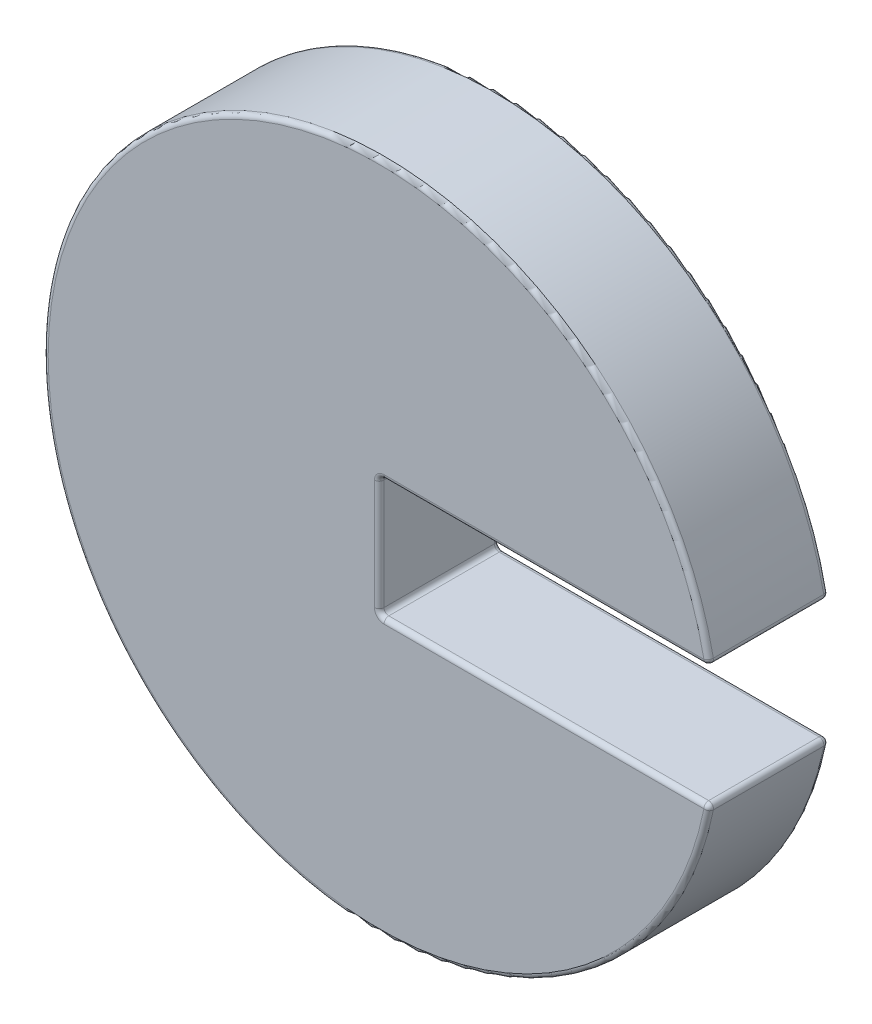
ISO-10303-21;
HEADER;
FILE_DESCRIPTION(('STEP AP214'),'2;1');
FILE_NAME('part.step','',(''),(''),'','','');
FILE_SCHEMA(('AUTOMOTIVE_DESIGN { 1 0 10303 214 1 1 1 1 }'));
ENDSEC;
DATA;
#1=APPLICATION_CONTEXT('core data for automotive mechanical design processes');
#2=APPLICATION_PROTOCOL_DEFINITION('international standard','automotive_design',2000,#1);
#3=PRODUCT_CONTEXT('',#1,'mechanical');
#4=PRODUCT('Part','Part','',(#3));
#5=PRODUCT_RELATED_PRODUCT_CATEGORY('part','',(#4));
#6=PRODUCT_DEFINITION_FORMATION('','',#4);
#7=PRODUCT_DEFINITION_CONTEXT('part definition',#1,'design');
#8=PRODUCT_DEFINITION('design','',#6,#7);
#9=PRODUCT_DEFINITION_SHAPE('','',#8);
#10=(LENGTH_UNIT() NAMED_UNIT(*) SI_UNIT(.MILLI.,.METRE.));
#11=(NAMED_UNIT(*) PLANE_ANGLE_UNIT() SI_UNIT($,.RADIAN.));
#12=(NAMED_UNIT(*) SI_UNIT($,.STERADIAN.) SOLID_ANGLE_UNIT());
#13=UNCERTAINTY_MEASURE_WITH_UNIT(LENGTH_MEASURE(1.E-05),#10,'distance_accuracy_value','');
#14=(GEOMETRIC_REPRESENTATION_CONTEXT(3) GLOBAL_UNCERTAINTY_ASSIGNED_CONTEXT((#13)) GLOBAL_UNIT_ASSIGNED_CONTEXT((#10,
#11,#12)) REPRESENTATION_CONTEXT('',''));
#15=CARTESIAN_POINT('',(0.,0.,0.));
#16=DIRECTION('',(0.,0.,1.));
#17=DIRECTION('',(1.,0.,0.));
#18=AXIS2_PLACEMENT_3D('',#15,#16,#17);
#19=CARTESIAN_POINT('',(0.,0.,2.5));
#20=DIRECTION('',(0.,0.,1.));
#21=DIRECTION('',(1.,0.,0.));
#22=AXIS2_PLACEMENT_3D('',#19,#20,#21);
#23=PLANE('',#22);
#24=CARTESIAN_POINT('',(-88.6343742525764,18.31347196983,2.5));
#25=DIRECTION('',(0.,0.,1.));
#26=DIRECTION('',(1.,0.,0.));
#27=AXIS2_PLACEMENT_3D('',#24,#25,#26);
#28=CIRCLE('',#27,0.2);
#29=CARTESIAN_POINT('',(-88.8343742525764,18.31347196983,2.5));
#30=VERTEX_POINT('',#29);
#31=CARTESIAN_POINT('',(-88.6343742525764,18.11347196983,2.5));
#32=VERTEX_POINT('',#31);
#33=EDGE_CURVE('E209',#30,#32,#28,.T.);
#34=ORIENTED_EDGE('',*,*,#33,.F.);
#35=DIRECTION('',(0.,-1.,0.));
#36=VECTOR('',#35,1.);
#37=CARTESIAN_POINT('',(-88.8343742525764,0.,2.5));
#38=LINE('',#37,#36);
#39=CARTESIAN_POINT('',(-88.8343742525764,20.61347196983,2.5));
#40=VERTEX_POINT('',#39);
#41=EDGE_CURVE('E206',#30,#40,#38,.F.);
#42=ORIENTED_EDGE('',*,*,#41,.T.);
#43=CARTESIAN_POINT('',(-88.6343742525764,20.61347196983,2.5));
#44=DIRECTION('',(0.,0.,1.));
#45=DIRECTION('',(1.,0.,0.));
#46=AXIS2_PLACEMENT_3D('',#43,#44,#45);
#47=CIRCLE('',#46,0.2);
#48=CARTESIAN_POINT('',(-88.6343742525764,20.81347196983,2.5));
#49=VERTEX_POINT('',#48);
#50=EDGE_CURVE('E204',#49,#40,#47,.T.);
#51=ORIENTED_EDGE('',*,*,#50,.F.);
#52=DIRECTION('',(1.,0.,0.));
#53=VECTOR('',#52,1.);
#54=CARTESIAN_POINT('',(-81.8468855955985,20.81347196983,2.5));
#55=LINE('',#54,#53);
#56=CARTESIAN_POINT('',(-81.9677281113924,20.81347196983,2.5));
#57=VERTEX_POINT('',#56);
#58=EDGE_CURVE('E198',#49,#57,#55,.T.);
#59=ORIENTED_EDGE('',*,*,#58,.T.);
#60=CARTESIAN_POINT('',(-88.7343742525764,19.46347196983,2.5));
#61=DIRECTION('',(0.,0.,1.));
#62=DIRECTION('',(1.,0.,0.));
#63=AXIS2_PLACEMENT_3D('',#60,#61,#62);
#64=CIRCLE('',#63,6.9);
#65=CARTESIAN_POINT('',(-81.9677281113924,18.11347196983,2.5));
#66=VERTEX_POINT('',#65);
#67=EDGE_CURVE('E200',#57,#66,#64,.T.);
#68=ORIENTED_EDGE('',*,*,#67,.T.);
#69=DIRECTION('',(1.,0.,0.));
#70=VECTOR('',#69,1.);
#71=CARTESIAN_POINT('',(0.,18.11347196983,2.5));
#72=LINE('',#71,#70);
#73=EDGE_CURVE('E202',#66,#32,#72,.F.);
#74=ORIENTED_EDGE('',*,*,#73,.T.);
#75=EDGE_LOOP('',(#34,#42,#51,#59,#68,#74));
#76=FACE_BOUND('',#75,.T.);
#77=ADVANCED_FACE('F34',(#76),#23,.T.);
#78=CARTESIAN_POINT('',(0.,20.71347196983,2.5));
#79=DIRECTION('',(0.,1.,0.));
#80=DIRECTION('',(0.,0.,1.));
#81=AXIS2_PLACEMENT_3D('',#78,#79,#80);
#82=PLANE('',#81);
#83=DIRECTION('',(0.,0.,-1.));
#84=VECTOR('',#83,1.);
#85=CARTESIAN_POINT('',(-81.9677281113924,20.71347196983,2.5));
#86=LINE('',#85,#84);
#87=CARTESIAN_POINT('',(-81.9677281113924,20.71347196983,0.0999999999999998));
#88=VERTEX_POINT('',#87);
#89=CARTESIAN_POINT('',(-81.9677281113924,20.71347196983,2.4));
#90=VERTEX_POINT('',#89);
#91=EDGE_CURVE('E141',#88,#90,#86,.F.);
#92=ORIENTED_EDGE('',*,*,#91,.T.);
#93=DIRECTION('',(1.,0.,0.));
#94=VECTOR('',#93,1.);
#95=CARTESIAN_POINT('',(-88.7343742525764,20.71347196983,2.4));
#96=LINE('',#95,#94);
#97=CARTESIAN_POINT('',(-88.6343742525764,20.71347196983,2.4));
#98=VERTEX_POINT('',#97);
#99=EDGE_CURVE('E178',#90,#98,#96,.F.);
#100=ORIENTED_EDGE('',*,*,#99,.T.);
#101=DIRECTION('',(0.,0.,-1.));
#102=VECTOR('',#101,1.);
#103=CARTESIAN_POINT('',(-88.6343742525764,20.71347196983,2.5));
#104=LINE('',#103,#102);
#105=CARTESIAN_POINT('',(-88.6343742525764,20.71347196983,0.0999999999999998));
#106=VERTEX_POINT('',#105);
#107=EDGE_CURVE('E175',#98,#106,#104,.T.);
#108=ORIENTED_EDGE('',*,*,#107,.T.);
#109=DIRECTION('',(1.,0.,0.));
#110=VECTOR('',#109,1.);
#111=CARTESIAN_POINT('',(0.,20.71347196983,0.0999999999999998));
#112=LINE('',#111,#110);
#113=EDGE_CURVE('E170',#106,#88,#112,.T.);
#114=ORIENTED_EDGE('',*,*,#113,.T.);
#115=EDGE_LOOP('',(#92,#100,#108,#114));
#116=FACE_BOUND('',#115,.T.);
#117=ADVANCED_FACE('F330',(#116),#82,.F.);
#118=CARTESIAN_POINT('',(-88.7343742525764,19.46347196983,2.5));
#119=DIRECTION('',(0.,0.,-1.));
#120=DIRECTION('',(-1.,0.,0.));
#121=AXIS2_PLACEMENT_3D('',#118,#119,#120);
#122=CYLINDRICAL_SURFACE('',#121,7.);
#123=DIRECTION('',(0.,0.,-1.));
#124=VECTOR('',#123,1.);
#125=CARTESIAN_POINT('',(-81.869660776013,18.0939067524387,2.5));
#126=LINE('',#125,#124);
#127=CARTESIAN_POINT('',(-81.869660776013,18.0939067524387,0.0999999999999998));
#128=VERTEX_POINT('',#127);
#129=CARTESIAN_POINT('',(-81.869660776013,18.0939067524387,2.4));
#130=VERTEX_POINT('',#129);
#131=EDGE_CURVE('E163',#128,#130,#126,.F.);
#132=ORIENTED_EDGE('',*,*,#131,.T.);
#133=CARTESIAN_POINT('',(-88.7343742525764,19.46347196983,2.4));
#134=DIRECTION('',(0.,0.,1.));
#135=DIRECTION('',(1.,0.,0.));
#136=AXIS2_PLACEMENT_3D('',#133,#134,#135);
#137=CIRCLE('',#136,7.);
#138=CARTESIAN_POINT('',(-81.869660776013,20.8330371872213,2.4));
#139=VERTEX_POINT('',#138);
#140=EDGE_CURVE('E167',#130,#139,#137,.F.);
#141=ORIENTED_EDGE('',*,*,#140,.T.);
#142=DIRECTION('',(0.,0.,-1.));
#143=VECTOR('',#142,1.);
#144=CARTESIAN_POINT('',(-81.869660776013,20.8330371872213,2.5));
#145=LINE('',#144,#143);
#146=CARTESIAN_POINT('',(-81.869660776013,20.8330371872213,0.0999999999999998));
#147=VERTEX_POINT('',#146);
#148=EDGE_CURVE('E139',#139,#147,#145,.T.);
#149=ORIENTED_EDGE('',*,*,#148,.T.);
#150=CARTESIAN_POINT('',(-88.7343742525764,19.46347196983,0.0999999999999998));
#151=DIRECTION('',(0.,0.,1.));
#152=DIRECTION('',(1.,0.,0.));
#153=AXIS2_PLACEMENT_3D('',#150,#151,#152);
#154=CIRCLE('',#153,7.);
#155=EDGE_CURVE('E157',#147,#128,#154,.T.);
#156=ORIENTED_EDGE('',*,*,#155,.T.);
#157=EDGE_LOOP('',(#132,#141,#149,#156));
#158=FACE_BOUND('',#157,.T.);
#159=ADVANCED_FACE('F165',(#158),#122,.T.);
#160=CARTESIAN_POINT('',(0.,18.21347196983,2.5));
#161=DIRECTION('',(0.,1.,0.));
#162=DIRECTION('',(0.,0.,1.));
#163=AXIS2_PLACEMENT_3D('',#160,#161,#162);
#164=PLANE('',#163);
#165=DIRECTION('',(0.,0.,-1.));
#166=VECTOR('',#165,1.);
#167=CARTESIAN_POINT('',(-88.6343742525764,18.21347196983,2.5));
#168=LINE('',#167,#166);
#169=CARTESIAN_POINT('',(-88.6343742525764,18.21347196983,0.1));
#170=VERTEX_POINT('',#169);
#171=CARTESIAN_POINT('',(-88.6343742525764,18.21347196983,2.4));
#172=VERTEX_POINT('',#171);
#173=EDGE_CURVE('E182',#170,#172,#168,.F.);
#174=ORIENTED_EDGE('',*,*,#173,.T.);
#175=DIRECTION('',(1.,0.,0.));
#176=VECTOR('',#175,1.);
#177=CARTESIAN_POINT('',(0.,18.21347196983,2.4));
#178=LINE('',#177,#176);
#179=CARTESIAN_POINT('',(-81.9677281113924,18.21347196983,2.4));
#180=VERTEX_POINT('',#179);
#181=EDGE_CURVE('E187',#172,#180,#178,.T.);
#182=ORIENTED_EDGE('',*,*,#181,.T.);
#183=DIRECTION('',(0.,0.,1.));
#184=VECTOR('',#183,1.);
#185=CARTESIAN_POINT('',(-81.9677281113924,18.21347196983,0.));
#186=LINE('',#185,#184);
#187=CARTESIAN_POINT('',(-81.9677281113924,18.21347196983,0.1));
#188=VERTEX_POINT('',#187);
#189=EDGE_CURVE('E184',#180,#188,#186,.F.);
#190=ORIENTED_EDGE('',*,*,#189,.T.);
#191=DIRECTION('',(1.,0.,0.));
#192=VECTOR('',#191,1.);
#193=CARTESIAN_POINT('',(-88.7343742525764,18.21347196983,0.1));
#194=LINE('',#193,#192);
#195=EDGE_CURVE('E180',#188,#170,#194,.F.);
#196=ORIENTED_EDGE('',*,*,#195,.T.);
#197=EDGE_LOOP('',(#174,#182,#190,#196));
#198=FACE_BOUND('',#197,.T.);
#199=ADVANCED_FACE('F302',(#198),#164,.T.);
#200=CARTESIAN_POINT('',(-88.7343742525764,0.,2.5));
#201=DIRECTION('',(1.,0.,0.));
#202=DIRECTION('',(0.,0.,-1.));
#203=AXIS2_PLACEMENT_3D('',#200,#201,#202);
#204=PLANE('',#203);
#205=DIRECTION('',(0.,0.,-1.));
#206=VECTOR('',#205,1.);
#207=CARTESIAN_POINT('',(-88.7343742525764,20.61347196983,2.5));
#208=LINE('',#207,#206);
#209=CARTESIAN_POINT('',(-88.7343742525764,20.61347196983,0.1));
#210=VERTEX_POINT('',#209);
#211=CARTESIAN_POINT('',(-88.7343742525764,20.61347196983,2.4));
#212=VERTEX_POINT('',#211);
#213=EDGE_CURVE('E191',#210,#212,#208,.F.);
#214=ORIENTED_EDGE('',*,*,#213,.T.);
#215=DIRECTION('',(0.,-1.,0.));
#216=VECTOR('',#215,1.);
#217=CARTESIAN_POINT('',(-88.7343742525764,0.,2.4));
#218=LINE('',#217,#216);
#219=CARTESIAN_POINT('',(-88.7343742525764,18.31347196983,2.4));
#220=VERTEX_POINT('',#219);
#221=EDGE_CURVE('E196',#212,#220,#218,.T.);
#222=ORIENTED_EDGE('',*,*,#221,.T.);
#223=DIRECTION('',(0.,0.,-1.));
#224=VECTOR('',#223,1.);
#225=CARTESIAN_POINT('',(-88.7343742525764,18.31347196983,0.));
#226=LINE('',#225,#224);
#227=CARTESIAN_POINT('',(-88.7343742525764,18.31347196983,0.1));
#228=VERTEX_POINT('',#227);
#229=EDGE_CURVE('E193',#220,#228,#226,.T.);
#230=ORIENTED_EDGE('',*,*,#229,.T.);
#231=DIRECTION('',(0.,-1.,0.));
#232=VECTOR('',#231,1.);
#233=CARTESIAN_POINT('',(-88.7343742525764,20.71347196983,0.1));
#234=LINE('',#233,#232);
#235=EDGE_CURVE('E189',#228,#210,#234,.F.);
#236=ORIENTED_EDGE('',*,*,#235,.T.);
#237=EDGE_LOOP('',(#214,#222,#230,#236));
#238=FACE_BOUND('',#237,.T.);
#239=ADVANCED_FACE('F313',(#238),#204,.T.);
#240=CARTESIAN_POINT('',(0.,0.,0.));
#241=DIRECTION('',(0.,0.,1.));
#242=DIRECTION('',(1.,0.,0.));
#243=AXIS2_PLACEMENT_3D('',#240,#241,#242);
#244=PLANE('',#243);
#245=CARTESIAN_POINT('',(-88.6343742525764,18.31347196983,0.));
#246=DIRECTION('',(0.,0.,1.));
#247=DIRECTION('',(1.,0.,0.));
#248=AXIS2_PLACEMENT_3D('',#245,#246,#247);
#249=CIRCLE('',#248,0.2);
#250=CARTESIAN_POINT('',(-88.6343742525764,18.11347196983,0.));
#251=VERTEX_POINT('',#250);
#252=CARTESIAN_POINT('',(-88.8343742525764,18.31347196983,0.));
#253=VERTEX_POINT('',#252);
#254=EDGE_CURVE('E43',#251,#253,#249,.F.);
#255=ORIENTED_EDGE('',*,*,#254,.F.);
#256=DIRECTION('',(1.,0.,0.));
#257=VECTOR('',#256,1.);
#258=CARTESIAN_POINT('',(-81.8468855955985,18.11347196983,0.));
#259=LINE('',#258,#257);
#260=CARTESIAN_POINT('',(-81.9677281113924,18.11347196983,0.));
#261=VERTEX_POINT('',#260);
#262=EDGE_CURVE('E11',#251,#261,#259,.T.);
#263=ORIENTED_EDGE('',*,*,#262,.T.);
#264=CARTESIAN_POINT('',(-88.7343742525764,19.46347196983,0.));
#265=DIRECTION('',(0.,0.,1.));
#266=DIRECTION('',(1.,0.,0.));
#267=AXIS2_PLACEMENT_3D('',#264,#265,#266);
#268=CIRCLE('',#267,6.9);
#269=CARTESIAN_POINT('',(-81.9677281113924,20.81347196983,0.));
#270=VERTEX_POINT('',#269);
#271=EDGE_CURVE('E219',#261,#270,#268,.F.);
#272=ORIENTED_EDGE('',*,*,#271,.T.);
#273=DIRECTION('',(1.,0.,0.));
#274=VECTOR('',#273,1.);
#275=CARTESIAN_POINT('',(0.,20.81347196983,0.));
#276=LINE('',#275,#274);
#277=CARTESIAN_POINT('',(-88.6343742525764,20.81347196983,0.));
#278=VERTEX_POINT('',#277);
#279=EDGE_CURVE('E215',#270,#278,#276,.F.);
#280=ORIENTED_EDGE('',*,*,#279,.T.);
#281=CARTESIAN_POINT('',(-88.6343742525764,20.61347196983,0.));
#282=DIRECTION('',(0.,0.,1.));
#283=DIRECTION('',(1.,0.,0.));
#284=AXIS2_PLACEMENT_3D('',#281,#282,#283);
#285=CIRCLE('',#284,0.2);
#286=CARTESIAN_POINT('',(-88.8343742525764,20.61347196983,0.));
#287=VERTEX_POINT('',#286);
#288=EDGE_CURVE('E212',#287,#278,#285,.F.);
#289=ORIENTED_EDGE('',*,*,#288,.F.);
#290=DIRECTION('',(0.,-1.,0.));
#291=VECTOR('',#290,1.);
#292=CARTESIAN_POINT('',(-88.8343742525764,18.21347196983,0.));
#293=LINE('',#292,#291);
#294=EDGE_CURVE('E217',#287,#253,#293,.T.);
#295=ORIENTED_EDGE('',*,*,#294,.T.);
#296=EDGE_LOOP('',(#255,#263,#272,#280,#289,#295));
#297=FACE_BOUND('',#296,.T.);
#298=ADVANCED_FACE('F360',(#297),#244,.F.);
#299=CARTESIAN_POINT('',(-88.6343742525764,18.31347196983,2.5));
#300=DIRECTION('',(0.,0.,1.));
#301=DIRECTION('',(1.,0.,0.));
#302=AXIS2_PLACEMENT_3D('',#299,#300,#301);
#303=CYLINDRICAL_SURFACE('',#302,0.1);
#304=CARTESIAN_POINT('',(-88.6343742525764,18.31347196983,2.4));
#305=DIRECTION('',(0.,0.,1.));
#306=DIRECTION('',(1.,0.,0.));
#307=AXIS2_PLACEMENT_3D('',#304,#305,#306);
#308=CIRCLE('',#307,0.1);
#309=EDGE_CURVE('E38',#172,#220,#308,.F.);
#310=ORIENTED_EDGE('',*,*,#309,.F.);
#311=ORIENTED_EDGE('',*,*,#173,.F.);
#312=CARTESIAN_POINT('',(-88.6343742525764,18.31347196983,0.0999999999999998));
#313=DIRECTION('',(0.,0.,1.));
#314=DIRECTION('',(1.,0.,0.));
#315=AXIS2_PLACEMENT_3D('',#312,#313,#314);
#316=CIRCLE('',#315,0.1);
#317=EDGE_CURVE('E273',#228,#170,#316,.T.);
#318=ORIENTED_EDGE('',*,*,#317,.F.);
#319=ORIENTED_EDGE('',*,*,#229,.F.);
#320=EDGE_LOOP('',(#310,#311,#318,#319));
#321=FACE_BOUND('',#320,.T.);
#322=ADVANCED_FACE('F36',(#321),#303,.F.);
#323=CARTESIAN_POINT('',(-88.6343742525764,18.31347196983,2.4));
#324=DIRECTION('',(0.,0.,1.));
#325=DIRECTION('',(1.,0.,0.));
#326=AXIS2_PLACEMENT_3D('',#323,#324,#325);
#327=TOROIDAL_SURFACE('',#326,0.2,0.1);
#328=CARTESIAN_POINT('',(-88.6343742525764,18.11347196983,2.4));
#329=DIRECTION('',(-1.,0.,0.));
#330=DIRECTION('',(0.,0.,1.));
#331=AXIS2_PLACEMENT_3D('',#328,#329,#330);
#332=CIRCLE('',#331,0.1);
#333=EDGE_CURVE('E268',#172,#32,#332,.F.);
#334=ORIENTED_EDGE('',*,*,#333,.F.);
#335=ORIENTED_EDGE('',*,*,#309,.T.);
#336=CARTESIAN_POINT('',(-88.8343742525764,18.31347196983,2.4));
#337=DIRECTION('',(0.,-1.,0.));
#338=DIRECTION('',(0.,0.,-1.));
#339=AXIS2_PLACEMENT_3D('',#336,#337,#338);
#340=CIRCLE('',#339,0.1);
#341=EDGE_CURVE('E271',#30,#220,#340,.F.);
#342=ORIENTED_EDGE('',*,*,#341,.F.);
#343=ORIENTED_EDGE('',*,*,#33,.T.);
#344=EDGE_LOOP('',(#334,#335,#342,#343));
#345=FACE_BOUND('',#344,.T.);
#346=ADVANCED_FACE('F283',(#345),#327,.T.);
#347=CARTESIAN_POINT('',(-88.6343742525764,18.31347196983,0.0999999999999998));
#348=DIRECTION('',(0.,0.,1.));
#349=DIRECTION('',(1.,0.,0.));
#350=AXIS2_PLACEMENT_3D('',#347,#348,#349);
#351=TOROIDAL_SURFACE('',#350,0.2,0.1);
#352=CARTESIAN_POINT('',(-88.8343742525764,18.31347196983,0.1));
#353=DIRECTION('',(0.,-1.,0.));
#354=DIRECTION('',(0.,0.,-1.));
#355=AXIS2_PLACEMENT_3D('',#352,#353,#354);
#356=CIRCLE('',#355,0.1);
#357=EDGE_CURVE('E262',#228,#253,#356,.F.);
#358=ORIENTED_EDGE('',*,*,#357,.F.);
#359=ORIENTED_EDGE('',*,*,#317,.T.);
#360=CARTESIAN_POINT('',(-88.6343742525764,18.11347196983,0.1));
#361=DIRECTION('',(-1.,0.,0.));
#362=DIRECTION('',(0.,0.,1.));
#363=AXIS2_PLACEMENT_3D('',#360,#361,#362);
#364=CIRCLE('',#363,0.1);
#365=EDGE_CURVE('E265',#251,#170,#364,.F.);
#366=ORIENTED_EDGE('',*,*,#365,.F.);
#367=ORIENTED_EDGE('',*,*,#254,.T.);
#368=EDGE_LOOP('',(#358,#359,#366,#367));
#369=FACE_BOUND('',#368,.T.);
#370=ADVANCED_FACE('F490',(#369),#351,.T.);
#371=CARTESIAN_POINT('',(-88.8343742525764,0.,2.4));
#372=DIRECTION('',(0.,-1.,0.));
#373=DIRECTION('',(0.,0.,-1.));
#374=AXIS2_PLACEMENT_3D('',#371,#372,#373);
#375=CYLINDRICAL_SURFACE('',#374,0.1);
#376=ORIENTED_EDGE('',*,*,#341,.T.);
#377=ORIENTED_EDGE('',*,*,#221,.F.);
#378=CARTESIAN_POINT('',(-88.8343742525764,20.61347196983,2.4));
#379=DIRECTION('',(0.,1.,0.));
#380=DIRECTION('',(0.,0.,1.));
#381=AXIS2_PLACEMENT_3D('',#378,#379,#380);
#382=CIRCLE('',#381,0.1);
#383=EDGE_CURVE('E256',#40,#212,#382,.T.);
#384=ORIENTED_EDGE('',*,*,#383,.F.);
#385=ORIENTED_EDGE('',*,*,#41,.F.);
#386=EDGE_LOOP('',(#376,#377,#384,#385));
#387=FACE_BOUND('',#386,.T.);
#388=ADVANCED_FACE('F291',(#387),#375,.T.);
#389=CARTESIAN_POINT('',(0.,18.11347196983,2.4));
#390=DIRECTION('',(1.,0.,0.));
#391=DIRECTION('',(0.,0.,-1.));
#392=AXIS2_PLACEMENT_3D('',#389,#390,#391);
#393=CYLINDRICAL_SURFACE('',#392,0.1);
#394=ORIENTED_EDGE('',*,*,#333,.T.);
#395=ORIENTED_EDGE('',*,*,#73,.F.);
#396=CARTESIAN_POINT('',(-81.9677281113924,18.11347196983,2.4));
#397=DIRECTION('',(1.,0.,0.));
#398=DIRECTION('',(0.,0.,-1.));
#399=AXIS2_PLACEMENT_3D('',#396,#397,#398);
#400=CIRCLE('',#399,0.1);
#401=EDGE_CURVE('E253',#180,#66,#400,.T.);
#402=ORIENTED_EDGE('',*,*,#401,.F.);
#403=ORIENTED_EDGE('',*,*,#181,.F.);
#404=EDGE_LOOP('',(#394,#395,#402,#403));
#405=FACE_BOUND('',#404,.T.);
#406=ADVANCED_FACE('F298',(#405),#393,.T.);
#407=CARTESIAN_POINT('',(-81.9677281113924,18.11347196983,2.5));
#408=DIRECTION('',(0.,0.,-1.));
#409=DIRECTION('',(-1.,0.,0.));
#410=AXIS2_PLACEMENT_3D('',#407,#408,#409);
#411=CYLINDRICAL_SURFACE('',#410,0.1);
#412=CARTESIAN_POINT('',(-81.9677281113924,18.11347196983,0.1));
#413=DIRECTION('',(0.,0.,-1.));
#414=DIRECTION('',(-1.,0.,0.));
#415=AXIS2_PLACEMENT_3D('',#412,#413,#414);
#416=CIRCLE('',#415,0.1);
#417=EDGE_CURVE('E247',#188,#128,#416,.T.);
#418=ORIENTED_EDGE('',*,*,#417,.F.);
#419=ORIENTED_EDGE('',*,*,#189,.F.);
#420=CARTESIAN_POINT('',(-81.9677281113924,18.11347196983,2.4));
#421=DIRECTION('',(0.,0.,1.));
#422=DIRECTION('',(1.,0.,0.));
#423=AXIS2_PLACEMENT_3D('',#420,#421,#422);
#424=CIRCLE('',#423,0.1);
#425=EDGE_CURVE('E250',#130,#180,#424,.T.);
#426=ORIENTED_EDGE('',*,*,#425,.F.);
#427=ORIENTED_EDGE('',*,*,#131,.F.);
#428=EDGE_LOOP('',(#418,#419,#426,#427));
#429=FACE_BOUND('',#428,.T.);
#430=ADVANCED_FACE('F306',(#429),#411,.T.);
#431=CARTESIAN_POINT('',(0.,18.11347196983,0.1));
#432=DIRECTION('',(-1.,0.,0.));
#433=DIRECTION('',(0.,0.,1.));
#434=AXIS2_PLACEMENT_3D('',#431,#432,#433);
#435=CYLINDRICAL_SURFACE('',#434,0.1);
#436=ORIENTED_EDGE('',*,*,#365,.T.);
#437=ORIENTED_EDGE('',*,*,#195,.F.);
#438=CARTESIAN_POINT('',(-81.9677281113924,18.11347196983,0.1));
#439=DIRECTION('',(1.,0.,0.));
#440=DIRECTION('',(0.,0.,-1.));
#441=AXIS2_PLACEMENT_3D('',#438,#439,#440);
#442=CIRCLE('',#441,0.1);
#443=EDGE_CURVE('E245',#261,#188,#442,.T.);
#444=ORIENTED_EDGE('',*,*,#443,.F.);
#445=ORIENTED_EDGE('',*,*,#262,.F.);
#446=EDGE_LOOP('',(#436,#437,#444,#445));
#447=FACE_BOUND('',#446,.T.);
#448=ADVANCED_FACE('F311',(#447),#435,.T.);
#449=CARTESIAN_POINT('',(-88.8343742525764,0.,0.1));
#450=DIRECTION('',(0.,1.,0.));
#451=DIRECTION('',(0.,0.,1.));
#452=AXIS2_PLACEMENT_3D('',#449,#450,#451);
#453=CYLINDRICAL_SURFACE('',#452,0.1);
#454=ORIENTED_EDGE('',*,*,#357,.T.);
#455=ORIENTED_EDGE('',*,*,#294,.F.);
#456=CARTESIAN_POINT('',(-88.8343742525764,20.61347196983,0.1));
#457=DIRECTION('',(0.,1.,0.));
#458=DIRECTION('',(0.,0.,1.));
#459=AXIS2_PLACEMENT_3D('',#456,#457,#458);
#460=CIRCLE('',#459,0.1);
#461=EDGE_CURVE('E242',#210,#287,#460,.T.);
#462=ORIENTED_EDGE('',*,*,#461,.F.);
#463=ORIENTED_EDGE('',*,*,#235,.F.);
#464=EDGE_LOOP('',(#454,#455,#462,#463));
#465=FACE_BOUND('',#464,.T.);
#466=ADVANCED_FACE('F323',(#465),#453,.T.);
#467=CARTESIAN_POINT('',(-88.6343742525764,20.61347196983,2.5));
#468=DIRECTION('',(0.,0.,-1.));
#469=DIRECTION('',(-1.,0.,0.));
#470=AXIS2_PLACEMENT_3D('',#467,#468,#469);
#471=CYLINDRICAL_SURFACE('',#470,0.1);
#472=CARTESIAN_POINT('',(-88.6343742525764,20.61347196983,2.4));
#473=DIRECTION('',(0.,0.,1.));
#474=DIRECTION('',(1.,0.,0.));
#475=AXIS2_PLACEMENT_3D('',#472,#473,#474);
#476=CIRCLE('',#475,0.1);
#477=EDGE_CURVE('E259',#212,#98,#476,.F.);
#478=ORIENTED_EDGE('',*,*,#477,.F.);
#479=ORIENTED_EDGE('',*,*,#213,.F.);
#480=CARTESIAN_POINT('',(-88.6343742525764,20.61347196983,0.0999999999999998));
#481=DIRECTION('',(0.,0.,1.));
#482=DIRECTION('',(1.,0.,0.));
#483=AXIS2_PLACEMENT_3D('',#480,#481,#482);
#484=CIRCLE('',#483,0.1);
#485=EDGE_CURVE('E239',#106,#210,#484,.T.);
#486=ORIENTED_EDGE('',*,*,#485,.F.);
#487=ORIENTED_EDGE('',*,*,#107,.F.);
#488=EDGE_LOOP('',(#478,#479,#486,#487));
#489=FACE_BOUND('',#488,.T.);
#490=ADVANCED_FACE('F318',(#489),#471,.F.);
#491=CARTESIAN_POINT('',(-88.6343742525764,20.61347196983,2.4));
#492=DIRECTION('',(0.,0.,1.));
#493=DIRECTION('',(1.,0.,0.));
#494=AXIS2_PLACEMENT_3D('',#491,#492,#493);
#495=TOROIDAL_SURFACE('',#494,0.2,0.1);
#496=ORIENTED_EDGE('',*,*,#383,.T.);
#497=ORIENTED_EDGE('',*,*,#477,.T.);
#498=CARTESIAN_POINT('',(-88.6343742525764,20.81347196983,2.4));
#499=DIRECTION('',(-1.,0.,0.));
#500=DIRECTION('',(0.,0.,1.));
#501=AXIS2_PLACEMENT_3D('',#498,#499,#500);
#502=CIRCLE('',#501,0.1);
#503=EDGE_CURVE('E236',#49,#98,#502,.F.);
#504=ORIENTED_EDGE('',*,*,#503,.F.);
#505=ORIENTED_EDGE('',*,*,#50,.T.);
#506=EDGE_LOOP('',(#496,#497,#504,#505));
#507=FACE_BOUND('',#506,.T.);
#508=ADVANCED_FACE('F333',(#507),#495,.T.);
#509=CARTESIAN_POINT('',(-81.9677281113924,18.11347196983,2.4));
#510=DIRECTION('',(0.,0.,1.));
#511=DIRECTION('',(1.,0.,0.));
#512=AXIS2_PLACEMENT_3D('',#509,#510,#511);
#513=SPHERICAL_SURFACE('',#512,0.1);
#514=ORIENTED_EDGE('',*,*,#425,.T.);
#515=ORIENTED_EDGE('',*,*,#401,.T.);
#516=CARTESIAN_POINT('',(-81.9677281113924,18.11347196983,2.4));
#517=DIRECTION('',(0.195652173913041,0.98067335379478,0.));
#518=DIRECTION('',(-0.98067335379478,0.195652173913041,0.));
#519=AXIS2_PLACEMENT_3D('',#516,#517,#518);
#520=CIRCLE('',#519,0.1);
#521=EDGE_CURVE('E233',#130,#66,#520,.F.);
#522=ORIENTED_EDGE('',*,*,#521,.F.);
#523=EDGE_LOOP('',(#514,#515,#522));
#524=FACE_BOUND('',#523,.T.);
#525=ADVANCED_FACE('F343',(#524),#513,.T.);
#526=CARTESIAN_POINT('',(-81.9677281113924,18.11347196983,0.1));
#527=DIRECTION('',(0.,0.,1.));
#528=DIRECTION('',(1.,0.,0.));
#529=AXIS2_PLACEMENT_3D('',#526,#527,#528);
#530=SPHERICAL_SURFACE('',#529,0.1);
#531=ORIENTED_EDGE('',*,*,#443,.T.);
#532=ORIENTED_EDGE('',*,*,#417,.T.);
#533=CARTESIAN_POINT('',(-81.9677281113924,18.11347196983,0.0999999999999998));
#534=DIRECTION('',(0.195652173913048,0.980673353794778,0.));
#535=DIRECTION('',(-0.980673353794778,0.195652173913048,0.));
#536=AXIS2_PLACEMENT_3D('',#533,#534,#535);
#537=CIRCLE('',#536,0.1);
#538=EDGE_CURVE('E160',#261,#128,#537,.F.);
#539=ORIENTED_EDGE('',*,*,#538,.F.);
#540=EDGE_LOOP('',(#531,#532,#539));
#541=FACE_BOUND('',#540,.T.);
#542=ADVANCED_FACE('F345',(#541),#530,.T.);
#543=CARTESIAN_POINT('',(-88.6343742525764,20.61347196983,0.0999999999999998));
#544=DIRECTION('',(0.,0.,1.));
#545=DIRECTION('',(1.,0.,0.));
#546=AXIS2_PLACEMENT_3D('',#543,#544,#545);
#547=TOROIDAL_SURFACE('',#546,0.2,0.1);
#548=ORIENTED_EDGE('',*,*,#461,.T.);
#549=ORIENTED_EDGE('',*,*,#288,.T.);
#550=CARTESIAN_POINT('',(-88.6343742525764,20.81347196983,0.1));
#551=DIRECTION('',(-1.,0.,0.));
#552=DIRECTION('',(0.,0.,1.));
#553=AXIS2_PLACEMENT_3D('',#550,#551,#552);
#554=CIRCLE('',#553,0.1);
#555=EDGE_CURVE('E229',#106,#278,#554,.F.);
#556=ORIENTED_EDGE('',*,*,#555,.F.);
#557=ORIENTED_EDGE('',*,*,#485,.T.);
#558=EDGE_LOOP('',(#548,#549,#556,#557));
#559=FACE_BOUND('',#558,.T.);
#560=ADVANCED_FACE('F325',(#559),#547,.T.);
#561=CARTESIAN_POINT('',(0.,20.81347196983,2.4));
#562=DIRECTION('',(-1.,0.,0.));
#563=DIRECTION('',(0.,0.,1.));
#564=AXIS2_PLACEMENT_3D('',#561,#562,#563);
#565=CYLINDRICAL_SURFACE('',#564,0.1);
#566=ORIENTED_EDGE('',*,*,#503,.T.);
#567=ORIENTED_EDGE('',*,*,#99,.F.);
#568=CARTESIAN_POINT('',(-81.9677281113924,20.81347196983,2.4));
#569=DIRECTION('',(1.,0.,0.));
#570=DIRECTION('',(0.,0.,-1.));
#571=AXIS2_PLACEMENT_3D('',#568,#569,#570);
#572=CIRCLE('',#571,0.1);
#573=EDGE_CURVE('E226',#57,#90,#572,.T.);
#574=ORIENTED_EDGE('',*,*,#573,.F.);
#575=ORIENTED_EDGE('',*,*,#58,.F.);
#576=EDGE_LOOP('',(#566,#567,#574,#575));
#577=FACE_BOUND('',#576,.T.);
#578=ADVANCED_FACE('F336',(#577),#565,.T.);
#579=CARTESIAN_POINT('',(-88.7343742525764,19.46347196983,2.4));
#580=DIRECTION('',(0.,0.,1.));
#581=DIRECTION('',(1.,0.,0.));
#582=AXIS2_PLACEMENT_3D('',#579,#580,#581);
#583=TOROIDAL_SURFACE('',#582,6.9,0.1);
#584=ORIENTED_EDGE('',*,*,#521,.T.);
#585=ORIENTED_EDGE('',*,*,#67,.F.);
#586=CARTESIAN_POINT('',(-81.9677281113924,20.81347196983,2.4));
#587=DIRECTION('',(0.195652173913048,-0.980673353794778,0.));
#588=DIRECTION('',(0.980673353794778,0.195652173913048,0.));
#589=AXIS2_PLACEMENT_3D('',#586,#587,#588);
#590=CIRCLE('',#589,0.1);
#591=EDGE_CURVE('E154',#139,#57,#590,.T.);
#592=ORIENTED_EDGE('',*,*,#591,.F.);
#593=ORIENTED_EDGE('',*,*,#140,.F.);
#594=EDGE_LOOP('',(#584,#585,#592,#593));
#595=FACE_BOUND('',#594,.T.);
#596=ADVANCED_FACE('F340',(#595),#583,.T.);
#597=CARTESIAN_POINT('',(-88.7343742525764,19.46347196983,0.0999999999999998));
#598=DIRECTION('',(0.,0.,1.));
#599=DIRECTION('',(1.,0.,0.));
#600=AXIS2_PLACEMENT_3D('',#597,#598,#599);
#601=TOROIDAL_SURFACE('',#600,6.9,0.1);
#602=ORIENTED_EDGE('',*,*,#538,.T.);
#603=ORIENTED_EDGE('',*,*,#155,.F.);
#604=CARTESIAN_POINT('',(-81.9677281113924,20.81347196983,0.1));
#605=DIRECTION('',(0.195652173913041,-0.98067335379478,0.));
#606=DIRECTION('',(0.98067335379478,0.195652173913041,0.));
#607=AXIS2_PLACEMENT_3D('',#604,#605,#606);
#608=CIRCLE('',#607,0.1);
#609=EDGE_CURVE('E146',#270,#147,#608,.T.);
#610=ORIENTED_EDGE('',*,*,#609,.F.);
#611=ORIENTED_EDGE('',*,*,#271,.F.);
#612=EDGE_LOOP('',(#602,#603,#610,#611));
#613=FACE_BOUND('',#612,.T.);
#614=ADVANCED_FACE('F158',(#613),#601,.T.);
#615=CARTESIAN_POINT('',(0.,20.81347196983,0.0999999999999998));
#616=DIRECTION('',(1.,0.,0.));
#617=DIRECTION('',(0.,0.,-1.));
#618=AXIS2_PLACEMENT_3D('',#615,#616,#617);
#619=CYLINDRICAL_SURFACE('',#618,0.1);
#620=ORIENTED_EDGE('',*,*,#555,.T.);
#621=ORIENTED_EDGE('',*,*,#279,.F.);
#622=CARTESIAN_POINT('',(-81.9677281113924,20.81347196983,0.0999999999999998));
#623=DIRECTION('',(1.,0.,0.));
#624=DIRECTION('',(0.,0.,-1.));
#625=AXIS2_PLACEMENT_3D('',#622,#623,#624);
#626=CIRCLE('',#625,0.1);
#627=EDGE_CURVE('E150',#88,#270,#626,.T.);
#628=ORIENTED_EDGE('',*,*,#627,.F.);
#629=ORIENTED_EDGE('',*,*,#113,.F.);
#630=EDGE_LOOP('',(#620,#621,#628,#629));
#631=FACE_BOUND('',#630,.T.);
#632=ADVANCED_FACE('F328',(#631),#619,.T.);
#633=CARTESIAN_POINT('',(-81.9677281113924,20.81347196983,2.4));
#634=DIRECTION('',(0.,0.,1.));
#635=DIRECTION('',(1.,0.,0.));
#636=AXIS2_PLACEMENT_3D('',#633,#634,#635);
#637=SPHERICAL_SURFACE('',#636,0.1);
#638=ORIENTED_EDGE('',*,*,#591,.T.);
#639=ORIENTED_EDGE('',*,*,#573,.T.);
#640=CARTESIAN_POINT('',(-81.9677281113924,20.81347196983,2.4));
#641=DIRECTION('',(0.,0.,1.));
#642=DIRECTION('',(1.,0.,0.));
#643=AXIS2_PLACEMENT_3D('',#640,#641,#642);
#644=CIRCLE('',#643,0.1);
#645=EDGE_CURVE('E143',#139,#90,#644,.F.);
#646=ORIENTED_EDGE('',*,*,#645,.F.);
#647=EDGE_LOOP('',(#638,#639,#646));
#648=FACE_BOUND('',#647,.T.);
#649=ADVANCED_FACE('F373',(#648),#637,.T.);
#650=CARTESIAN_POINT('',(-81.9677281113924,20.81347196983,0.1));
#651=DIRECTION('',(0.,0.,1.));
#652=DIRECTION('',(1.,0.,0.));
#653=AXIS2_PLACEMENT_3D('',#650,#651,#652);
#654=SPHERICAL_SURFACE('',#653,0.1);
#655=ORIENTED_EDGE('',*,*,#627,.T.);
#656=ORIENTED_EDGE('',*,*,#609,.T.);
#657=CARTESIAN_POINT('',(-81.9677281113924,20.81347196983,0.0999999999999998));
#658=DIRECTION('',(0.,0.,-1.));
#659=DIRECTION('',(-1.,0.,0.));
#660=AXIS2_PLACEMENT_3D('',#657,#658,#659);
#661=CIRCLE('',#660,0.1);
#662=EDGE_CURVE('E135',#88,#147,#661,.F.);
#663=ORIENTED_EDGE('',*,*,#662,.F.);
#664=EDGE_LOOP('',(#655,#656,#663));
#665=FACE_BOUND('',#664,.T.);
#666=ADVANCED_FACE('F148',(#665),#654,.T.);
#667=CARTESIAN_POINT('',(-81.9677281113924,20.81347196983,2.5));
#668=DIRECTION('',(0.,0.,-1.));
#669=DIRECTION('',(-1.,0.,0.));
#670=AXIS2_PLACEMENT_3D('',#667,#668,#669);
#671=CYLINDRICAL_SURFACE('',#670,0.1);
#672=ORIENTED_EDGE('',*,*,#645,.T.);
#673=ORIENTED_EDGE('',*,*,#91,.F.);
#674=ORIENTED_EDGE('',*,*,#662,.T.);
#675=ORIENTED_EDGE('',*,*,#148,.F.);
#676=EDGE_LOOP('',(#672,#673,#674,#675));
#677=FACE_BOUND('',#676,.T.);
#678=ADVANCED_FACE('F137',(#677),#671,.T.);
#679=CLOSED_SHELL('',(#77,#117,#159,#199,#239,#298,#322,#346,#370,#388,#406,#430,#448,#466,#490,
#508,#525,#542,#560,#578,#596,#614,#632,#649,#666,#678));
#680=MANIFOLD_SOLID_BREP('B2',#679);
#681=ADVANCED_BREP_SHAPE_REPRESENTATION('',(#18,#680),#14);
#682=SHAPE_DEFINITION_REPRESENTATION(#9,#681);
ENDSEC;
END-ISO-10303-21;
